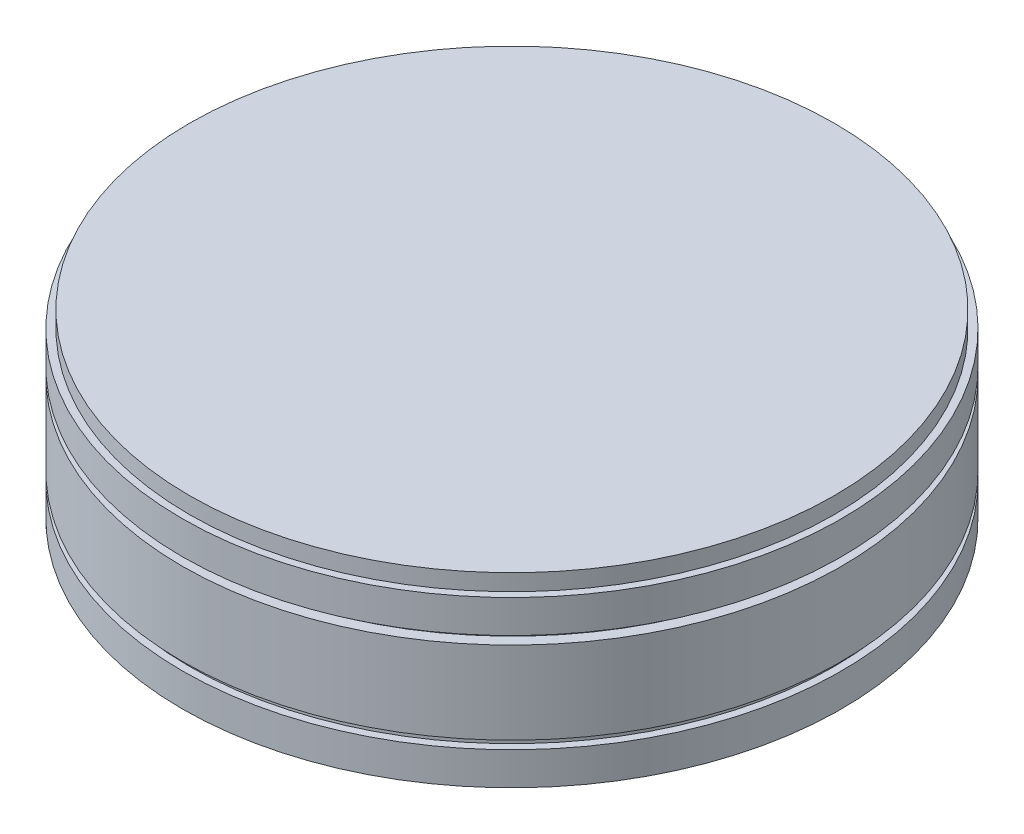
ISO-10303-21;
HEADER;
FILE_DESCRIPTION(('STEP AP214'),'2;1');
FILE_NAME('part.step','',(''),(''),'','','');
FILE_SCHEMA(('AUTOMOTIVE_DESIGN { 1 0 10303 214 1 1 1 1 }'));
ENDSEC;
DATA;
#1=APPLICATION_CONTEXT('core data for automotive mechanical design processes');
#2=APPLICATION_PROTOCOL_DEFINITION('international standard','automotive_design',2000,#1);
#3=PRODUCT_CONTEXT('',#1,'mechanical');
#4=PRODUCT('Part','Part','',(#3));
#5=PRODUCT_RELATED_PRODUCT_CATEGORY('part','',(#4));
#6=PRODUCT_DEFINITION_FORMATION('','',#4);
#7=PRODUCT_DEFINITION_CONTEXT('part definition',#1,'design');
#8=PRODUCT_DEFINITION('design','',#6,#7);
#9=PRODUCT_DEFINITION_SHAPE('','',#8);
#10=(LENGTH_UNIT() NAMED_UNIT(*) SI_UNIT(.MILLI.,.METRE.));
#11=(NAMED_UNIT(*) PLANE_ANGLE_UNIT() SI_UNIT($,.RADIAN.));
#12=(NAMED_UNIT(*) SI_UNIT($,.STERADIAN.) SOLID_ANGLE_UNIT());
#13=UNCERTAINTY_MEASURE_WITH_UNIT(LENGTH_MEASURE(1.E-05),#10,'distance_accuracy_value','');
#14=(GEOMETRIC_REPRESENTATION_CONTEXT(3) GLOBAL_UNCERTAINTY_ASSIGNED_CONTEXT((#13)) GLOBAL_UNIT_ASSIGNED_CONTEXT((#10,
#11,#12)) REPRESENTATION_CONTEXT('',''));
#15=CARTESIAN_POINT('',(0.,0.,0.));
#16=DIRECTION('',(0.,0.,1.));
#17=DIRECTION('',(1.,0.,0.));
#18=AXIS2_PLACEMENT_3D('',#15,#16,#17);
#19=CARTESIAN_POINT('',(0.,2.,0.));
#20=DIRECTION('',(0.,-1.,0.));
#21=DIRECTION('',(0.,0.,-1.));
#22=AXIS2_PLACEMENT_3D('',#19,#20,#21);
#23=CYLINDRICAL_SURFACE('',#22,20.);
#24=CARTESIAN_POINT('',(0.,2.,0.));
#25=DIRECTION('',(0.,1.,0.));
#26=DIRECTION('',(0.,0.,1.));
#27=AXIS2_PLACEMENT_3D('',#24,#25,#26);
#28=CIRCLE('',#27,20.);
#29=CARTESIAN_POINT('',(0.,2.,20.));
#30=VERTEX_POINT('',#29);
#31=EDGE_CURVE('E71',#30,#30,#28,.T.);
#32=ORIENTED_EDGE('',*,*,#31,.F.);
#33=EDGE_LOOP('',(#32));
#34=FACE_BOUND('',#33,.T.);
#35=CARTESIAN_POINT('',(0.,0.,0.));
#36=DIRECTION('',(0.,1.,0.));
#37=DIRECTION('',(0.,0.,1.));
#38=AXIS2_PLACEMENT_3D('',#35,#36,#37);
#39=CIRCLE('',#38,20.);
#40=CARTESIAN_POINT('',(0.,0.,20.));
#41=VERTEX_POINT('',#40);
#42=EDGE_CURVE('E38',#41,#41,#39,.T.);
#43=ORIENTED_EDGE('',*,*,#42,.T.);
#44=EDGE_LOOP('',(#43));
#45=FACE_BOUND('',#44,.T.);
#46=ADVANCED_FACE('F35',(#34,#45),#23,.T.);
#47=CARTESIAN_POINT('',(0.,2.,0.));
#48=DIRECTION('',(0.,1.,0.));
#49=DIRECTION('',(0.,0.,1.));
#50=AXIS2_PLACEMENT_3D('',#47,#48,#49);
#51=PLANE('',#50);
#52=CARTESIAN_POINT('',(0.,2.,0.));
#53=DIRECTION('',(0.,1.,0.));
#54=DIRECTION('',(0.,0.,1.));
#55=AXIS2_PLACEMENT_3D('',#52,#53,#54);
#56=CIRCLE('',#55,19.54948680197);
#57=CARTESIAN_POINT('',(0.,2.,19.54948680197));
#58=VERTEX_POINT('',#57);
#59=EDGE_CURVE('E47',#58,#58,#56,.T.);
#60=ORIENTED_EDGE('',*,*,#59,.F.);
#61=EDGE_LOOP('',(#60));
#62=FACE_BOUND('',#61,.T.);
#63=ORIENTED_EDGE('',*,*,#31,.T.);
#64=EDGE_LOOP('',(#63));
#65=FACE_BOUND('',#64,.T.);
#66=ADVANCED_FACE('F82',(#62,#65),#51,.T.);
#67=CARTESIAN_POINT('',(0.,0.,0.));
#68=DIRECTION('',(0.,1.,0.));
#69=DIRECTION('',(0.,0.,1.));
#70=AXIS2_PLACEMENT_3D('',#67,#68,#69);
#71=PLANE('',#70);
#72=ORIENTED_EDGE('',*,*,#42,.F.);
#73=EDGE_LOOP('',(#72));
#74=FACE_BOUND('',#73,.T.);
#75=ADVANCED_FACE('F79',(#74),#71,.F.);
#76=CARTESIAN_POINT('',(0.,2.5,0.));
#77=DIRECTION('',(0.,-1.,0.));
#78=DIRECTION('',(0.,0.,-1.));
#79=AXIS2_PLACEMENT_3D('',#76,#77,#78);
#80=CYLINDRICAL_SURFACE('',#79,19.54948680197);
#81=CARTESIAN_POINT('',(0.,2.5,0.));
#82=DIRECTION('',(0.,1.,0.));
#83=DIRECTION('',(0.,0.,1.));
#84=AXIS2_PLACEMENT_3D('',#81,#82,#83);
#85=CIRCLE('',#84,19.54948680197);
#86=CARTESIAN_POINT('',(0.,2.5,19.54948680197));
#87=VERTEX_POINT('',#86);
#88=EDGE_CURVE('E65',#87,#87,#85,.T.);
#89=ORIENTED_EDGE('',*,*,#88,.F.);
#90=EDGE_LOOP('',(#89));
#91=FACE_BOUND('',#90,.T.);
#92=ORIENTED_EDGE('',*,*,#59,.T.);
#93=EDGE_LOOP('',(#92));
#94=FACE_BOUND('',#93,.T.);
#95=ADVANCED_FACE('F81',(#91,#94),#80,.T.);
#96=CARTESIAN_POINT('',(0.,7.5,0.));
#97=DIRECTION('',(0.,-1.,0.));
#98=DIRECTION('',(0.,0.,-1.));
#99=AXIS2_PLACEMENT_3D('',#96,#97,#98);
#100=CYLINDRICAL_SURFACE('',#99,20.);
#101=CARTESIAN_POINT('',(0.,7.5,0.));
#102=DIRECTION('',(0.,1.,0.));
#103=DIRECTION('',(0.,0.,1.));
#104=AXIS2_PLACEMENT_3D('',#101,#102,#103);
#105=CIRCLE('',#104,20.);
#106=CARTESIAN_POINT('',(0.,7.5,20.));
#107=VERTEX_POINT('',#106);
#108=EDGE_CURVE('E62',#107,#107,#105,.T.);
#109=ORIENTED_EDGE('',*,*,#108,.F.);
#110=EDGE_LOOP('',(#109));
#111=FACE_BOUND('',#110,.T.);
#112=CARTESIAN_POINT('',(0.,2.5,0.));
#113=DIRECTION('',(0.,1.,0.));
#114=DIRECTION('',(0.,0.,1.));
#115=AXIS2_PLACEMENT_3D('',#112,#113,#114);
#116=CIRCLE('',#115,20.);
#117=CARTESIAN_POINT('',(0.,2.5,20.));
#118=VERTEX_POINT('',#117);
#119=EDGE_CURVE('E60',#118,#118,#116,.T.);
#120=ORIENTED_EDGE('',*,*,#119,.T.);
#121=EDGE_LOOP('',(#120));
#122=FACE_BOUND('',#121,.T.);
#123=ADVANCED_FACE('F87',(#111,#122),#100,.T.);
#124=CARTESIAN_POINT('',(0.,7.5,0.));
#125=DIRECTION('',(0.,1.,0.));
#126=DIRECTION('',(0.,0.,1.));
#127=AXIS2_PLACEMENT_3D('',#124,#125,#126);
#128=PLANE('',#127);
#129=CARTESIAN_POINT('',(0.,7.5,0.));
#130=DIRECTION('',(0.,1.,0.));
#131=DIRECTION('',(0.,0.,1.));
#132=AXIS2_PLACEMENT_3D('',#129,#130,#131);
#133=CIRCLE('',#132,19.3382481660703);
#134=CARTESIAN_POINT('',(0.,7.5,19.3382481660703));
#135=VERTEX_POINT('',#134);
#136=EDGE_CURVE('E42',#135,#135,#133,.T.);
#137=ORIENTED_EDGE('',*,*,#136,.F.);
#138=EDGE_LOOP('',(#137));
#139=FACE_BOUND('',#138,.T.);
#140=ORIENTED_EDGE('',*,*,#108,.T.);
#141=EDGE_LOOP('',(#140));
#142=FACE_BOUND('',#141,.T.);
#143=ADVANCED_FACE('F118',(#139,#142),#128,.T.);
#144=CARTESIAN_POINT('',(0.,2.5,0.));
#145=DIRECTION('',(0.,1.,0.));
#146=DIRECTION('',(0.,0.,1.));
#147=AXIS2_PLACEMENT_3D('',#144,#145,#146);
#148=PLANE('',#147);
#149=ORIENTED_EDGE('',*,*,#88,.T.);
#150=EDGE_LOOP('',(#149));
#151=FACE_BOUND('',#150,.T.);
#152=ORIENTED_EDGE('',*,*,#119,.F.);
#153=EDGE_LOOP('',(#152));
#154=FACE_BOUND('',#153,.T.);
#155=ADVANCED_FACE('F126',(#151,#154),#148,.F.);
#156=CARTESIAN_POINT('',(0.,8.,0.));
#157=DIRECTION('',(0.,-1.,0.));
#158=DIRECTION('',(0.,0.,-1.));
#159=AXIS2_PLACEMENT_3D('',#156,#157,#158);
#160=CYLINDRICAL_SURFACE('',#159,19.3382481660703);
#161=CARTESIAN_POINT('',(0.,8.,0.));
#162=DIRECTION('',(0.,1.,0.));
#163=DIRECTION('',(0.,0.,1.));
#164=AXIS2_PLACEMENT_3D('',#161,#162,#163);
#165=CIRCLE('',#164,19.3382481660703);
#166=CARTESIAN_POINT('',(0.,8.,19.3382481660703));
#167=VERTEX_POINT('',#166);
#168=EDGE_CURVE('E55',#167,#167,#165,.T.);
#169=ORIENTED_EDGE('',*,*,#168,.F.);
#170=EDGE_LOOP('',(#169));
#171=FACE_BOUND('',#170,.T.);
#172=ORIENTED_EDGE('',*,*,#136,.T.);
#173=EDGE_LOOP('',(#172));
#174=FACE_BOUND('',#173,.T.);
#175=ADVANCED_FACE('F131',(#171,#174),#160,.T.);
#176=CARTESIAN_POINT('',(0.,10.,0.));
#177=DIRECTION('',(0.,-1.,0.));
#178=DIRECTION('',(0.,0.,-1.));
#179=AXIS2_PLACEMENT_3D('',#176,#177,#178);
#180=CYLINDRICAL_SURFACE('',#179,20.);
#181=CARTESIAN_POINT('',(0.,10.,0.));
#182=DIRECTION('',(0.,1.,0.));
#183=DIRECTION('',(0.,0.,1.));
#184=AXIS2_PLACEMENT_3D('',#181,#182,#183);
#185=CIRCLE('',#184,20.);
#186=CARTESIAN_POINT('',(0.,10.,20.));
#187=VERTEX_POINT('',#186);
#188=EDGE_CURVE('E52',#187,#187,#185,.T.);
#189=ORIENTED_EDGE('',*,*,#188,.F.);
#190=EDGE_LOOP('',(#189));
#191=FACE_BOUND('',#190,.T.);
#192=CARTESIAN_POINT('',(0.,8.,0.));
#193=DIRECTION('',(0.,1.,0.));
#194=DIRECTION('',(0.,0.,1.));
#195=AXIS2_PLACEMENT_3D('',#192,#193,#194);
#196=CIRCLE('',#195,20.);
#197=CARTESIAN_POINT('',(0.,8.,20.));
#198=VERTEX_POINT('',#197);
#199=EDGE_CURVE('E56',#198,#198,#196,.T.);
#200=ORIENTED_EDGE('',*,*,#199,.T.);
#201=EDGE_LOOP('',(#200));
#202=FACE_BOUND('',#201,.T.);
#203=ADVANCED_FACE('F148',(#191,#202),#180,.T.);
#204=CARTESIAN_POINT('',(0.,10.,0.));
#205=DIRECTION('',(0.,1.,0.));
#206=DIRECTION('',(0.,0.,1.));
#207=AXIS2_PLACEMENT_3D('',#204,#205,#206);
#208=PLANE('',#207);
#209=CARTESIAN_POINT('',(0.,10.,0.));
#210=DIRECTION('',(0.,1.,0.));
#211=DIRECTION('',(0.,0.,1.));
#212=AXIS2_PLACEMENT_3D('',#209,#210,#211);
#213=CIRCLE('',#212,19.5691905969398);
#214=CARTESIAN_POINT('',(0.,10.,19.5691905969398));
#215=VERTEX_POINT('',#214);
#216=EDGE_CURVE('E10',#215,#215,#213,.T.);
#217=ORIENTED_EDGE('',*,*,#216,.F.);
#218=EDGE_LOOP('',(#217));
#219=FACE_BOUND('',#218,.T.);
#220=ORIENTED_EDGE('',*,*,#188,.T.);
#221=EDGE_LOOP('',(#220));
#222=FACE_BOUND('',#221,.T.);
#223=ADVANCED_FACE('F158',(#219,#222),#208,.T.);
#224=CARTESIAN_POINT('',(0.,8.,0.));
#225=DIRECTION('',(0.,1.,0.));
#226=DIRECTION('',(0.,0.,1.));
#227=AXIS2_PLACEMENT_3D('',#224,#225,#226);
#228=PLANE('',#227);
#229=ORIENTED_EDGE('',*,*,#168,.T.);
#230=EDGE_LOOP('',(#229));
#231=FACE_BOUND('',#230,.T.);
#232=ORIENTED_EDGE('',*,*,#199,.F.);
#233=EDGE_LOOP('',(#232));
#234=FACE_BOUND('',#233,.T.);
#235=ADVANCED_FACE('F166',(#231,#234),#228,.F.);
#236=CARTESIAN_POINT('',(0.,11.,0.));
#237=DIRECTION('',(0.,-1.,0.));
#238=DIRECTION('',(0.,0.,-1.));
#239=AXIS2_PLACEMENT_3D('',#236,#237,#238);
#240=CYLINDRICAL_SURFACE('',#239,19.5691905969398);
#241=CARTESIAN_POINT('',(0.,11.,0.));
#242=DIRECTION('',(0.,1.,0.));
#243=DIRECTION('',(0.,0.,1.));
#244=AXIS2_PLACEMENT_3D('',#241,#242,#243);
#245=CIRCLE('',#244,19.5691905969398);
#246=CARTESIAN_POINT('',(0.,11.,19.5691905969398));
#247=VERTEX_POINT('',#246);
#248=EDGE_CURVE('E51',#247,#247,#245,.T.);
#249=ORIENTED_EDGE('',*,*,#248,.F.);
#250=EDGE_LOOP('',(#249));
#251=FACE_BOUND('',#250,.T.);
#252=ORIENTED_EDGE('',*,*,#216,.T.);
#253=EDGE_LOOP('',(#252));
#254=FACE_BOUND('',#253,.T.);
#255=ADVANCED_FACE('F171',(#251,#254),#240,.T.);
#256=CARTESIAN_POINT('',(0.,11.,0.));
#257=DIRECTION('',(0.,1.,0.));
#258=DIRECTION('',(0.,0.,1.));
#259=AXIS2_PLACEMENT_3D('',#256,#257,#258);
#260=PLANE('',#259);
#261=ORIENTED_EDGE('',*,*,#248,.T.);
#262=EDGE_LOOP('',(#261));
#263=FACE_BOUND('',#262,.T.);
#264=ADVANCED_FACE('F188',(#263),#260,.T.);
#265=CLOSED_SHELL('',(#46,#66,#75,#95,#123,#143,#155,#175,#203,#223,#235,#255,#264));
#266=MANIFOLD_SOLID_BREP('B2',#265);
#267=ADVANCED_BREP_SHAPE_REPRESENTATION('',(#18,#266),#14);
#268=SHAPE_DEFINITION_REPRESENTATION(#9,#267);
ENDSEC;
END-ISO-10303-21;
